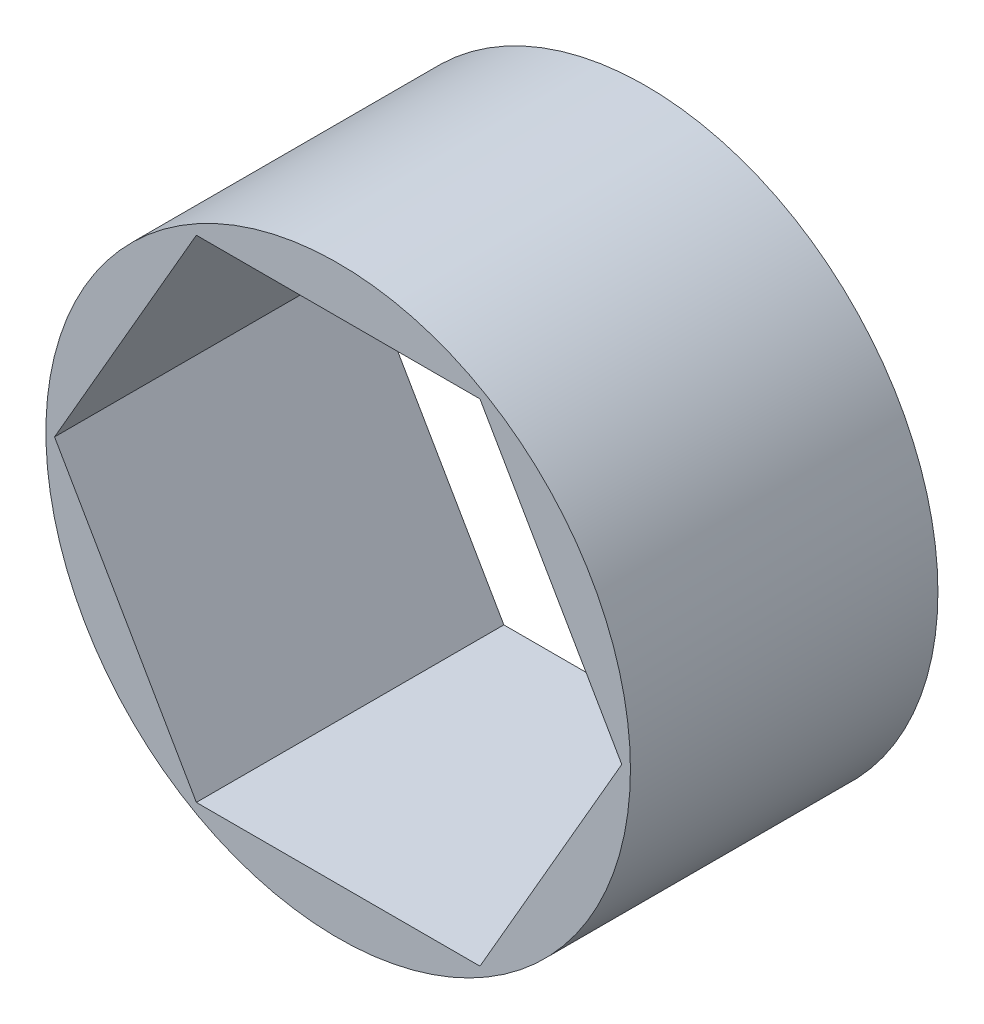
ISO-10303-21;
HEADER;
FILE_DESCRIPTION(('STEP AP214'),'2;1');
FILE_NAME('part.step','',(''),(''),'','','');
FILE_SCHEMA(('AUTOMOTIVE_DESIGN { 1 0 10303 214 1 1 1 1 }'));
ENDSEC;
DATA;
#1=APPLICATION_CONTEXT('core data for automotive mechanical design processes');
#2=APPLICATION_PROTOCOL_DEFINITION('international standard','automotive_design',2000,#1);
#3=PRODUCT_CONTEXT('',#1,'mechanical');
#4=PRODUCT('Part','Part','',(#3));
#5=PRODUCT_RELATED_PRODUCT_CATEGORY('part','',(#4));
#6=PRODUCT_DEFINITION_FORMATION('','',#4);
#7=PRODUCT_DEFINITION_CONTEXT('part definition',#1,'design');
#8=PRODUCT_DEFINITION('design','',#6,#7);
#9=PRODUCT_DEFINITION_SHAPE('','',#8);
#10=(LENGTH_UNIT() NAMED_UNIT(*) SI_UNIT(.MILLI.,.METRE.));
#11=(NAMED_UNIT(*) PLANE_ANGLE_UNIT() SI_UNIT($,.RADIAN.));
#12=(NAMED_UNIT(*) SI_UNIT($,.STERADIAN.) SOLID_ANGLE_UNIT());
#13=UNCERTAINTY_MEASURE_WITH_UNIT(LENGTH_MEASURE(1.E-05),#10,'distance_accuracy_value','');
#14=(GEOMETRIC_REPRESENTATION_CONTEXT(3) GLOBAL_UNCERTAINTY_ASSIGNED_CONTEXT((#13)) GLOBAL_UNIT_ASSIGNED_CONTEXT((#10,
#11,#12)) REPRESENTATION_CONTEXT('',''));
#15=CARTESIAN_POINT('',(0.,0.,0.));
#16=DIRECTION('',(0.,0.,1.));
#17=DIRECTION('',(1.,0.,0.));
#18=AXIS2_PLACEMENT_3D('',#15,#16,#17);
#19=CARTESIAN_POINT('',(0.,0.,7.9502));
#20=DIRECTION('',(0.,0.,-1.));
#21=DIRECTION('',(-1.,0.,0.));
#22=AXIS2_PLACEMENT_3D('',#19,#20,#21);
#23=CYLINDRICAL_SURFACE('',#22,7.5565);
#24=CARTESIAN_POINT('',(0.,0.,7.9502));
#25=DIRECTION('',(0.,0.,1.));
#26=DIRECTION('',(1.,0.,0.));
#27=AXIS2_PLACEMENT_3D('',#24,#25,#26);
#28=CIRCLE('',#27,7.5565);
#29=CARTESIAN_POINT('',(7.5565,0.,7.9502));
#30=VERTEX_POINT('',#29);
#31=EDGE_CURVE('E11',#30,#30,#28,.T.);
#32=ORIENTED_EDGE('',*,*,#31,.F.);
#33=EDGE_LOOP('',(#32));
#34=FACE_BOUND('',#33,.T.);
#35=CARTESIAN_POINT('',(0.,0.,0.));
#36=DIRECTION('',(0.,0.,1.));
#37=DIRECTION('',(1.,0.,0.));
#38=AXIS2_PLACEMENT_3D('',#35,#36,#37);
#39=CIRCLE('',#38,7.5565);
#40=CARTESIAN_POINT('',(7.5565,0.,0.));
#41=VERTEX_POINT('',#40);
#42=EDGE_CURVE('E48',#41,#41,#39,.T.);
#43=ORIENTED_EDGE('',*,*,#42,.T.);
#44=EDGE_LOOP('',(#43));
#45=FACE_BOUND('',#44,.T.);
#46=ADVANCED_FACE('F45',(#34,#45),#23,.T.);
#47=CARTESIAN_POINT('',(0.,0.,7.9502));
#48=DIRECTION('',(0.,0.,1.));
#49=DIRECTION('',(1.,0.,0.));
#50=AXIS2_PLACEMENT_3D('',#47,#48,#49);
#51=PLANE('',#50);
#52=DIRECTION('',(0.5,0.866025403784439,0.));
#53=VECTOR('',#52,1.);
#54=CARTESIAN_POINT('',(3.66617420935413,-6.35,7.9502));
#55=LINE('',#54,#53);
#56=CARTESIAN_POINT('',(3.66617420935413,-6.35,7.9502));
#57=VERTEX_POINT('',#56);
#58=CARTESIAN_POINT('',(7.33234841870825,0.,7.9502));
#59=VERTEX_POINT('',#58);
#60=EDGE_CURVE('E60',#57,#59,#55,.T.);
#61=ORIENTED_EDGE('',*,*,#60,.F.);
#62=DIRECTION('',(1.,0.,0.));
#63=VECTOR('',#62,1.);
#64=CARTESIAN_POINT('',(-3.66617420935412,-6.35,7.9502));
#65=LINE('',#64,#63);
#66=CARTESIAN_POINT('',(-3.66617420935412,-6.35,7.9502));
#67=VERTEX_POINT('',#66);
#68=EDGE_CURVE('E120',#67,#57,#65,.T.);
#69=ORIENTED_EDGE('',*,*,#68,.F.);
#70=DIRECTION('',(0.5,-0.866025403784439,0.));
#71=VECTOR('',#70,1.);
#72=CARTESIAN_POINT('',(-7.33234841870825,0.,7.9502));
#73=LINE('',#72,#71);
#74=CARTESIAN_POINT('',(-7.33234841870825,0.,7.9502));
#75=VERTEX_POINT('',#74);
#76=EDGE_CURVE('E124',#75,#67,#73,.T.);
#77=ORIENTED_EDGE('',*,*,#76,.F.);
#78=DIRECTION('',(-0.5,-0.866025403784439,0.));
#79=VECTOR('',#78,1.);
#80=CARTESIAN_POINT('',(-3.66617420935412,6.35,7.9502));
#81=LINE('',#80,#79);
#82=CARTESIAN_POINT('',(-3.66617420935412,6.35,7.9502));
#83=VERTEX_POINT('',#82);
#84=EDGE_CURVE('E147',#83,#75,#81,.T.);
#85=ORIENTED_EDGE('',*,*,#84,.F.);
#86=DIRECTION('',(-1.,0.,0.));
#87=VECTOR('',#86,1.);
#88=CARTESIAN_POINT('',(3.66617420935412,6.35,7.9502));
#89=LINE('',#88,#87);
#90=CARTESIAN_POINT('',(3.66617420935412,6.35,7.9502));
#91=VERTEX_POINT('',#90);
#92=EDGE_CURVE('E143',#91,#83,#89,.T.);
#93=ORIENTED_EDGE('',*,*,#92,.F.);
#94=DIRECTION('',(-0.5,0.866025403784438,0.));
#95=VECTOR('',#94,1.);
#96=CARTESIAN_POINT('',(7.33234841870825,0.,7.9502));
#97=LINE('',#96,#95);
#98=EDGE_CURVE('E140',#59,#91,#97,.T.);
#99=ORIENTED_EDGE('',*,*,#98,.F.);
#100=EDGE_LOOP('',(#61,#69,#77,#85,#93,#99));
#101=FACE_BOUND('',#100,.T.);
#102=ORIENTED_EDGE('',*,*,#31,.T.);
#103=EDGE_LOOP('',(#102));
#104=FACE_BOUND('',#103,.T.);
#105=ADVANCED_FACE('F171',(#101,#104),#51,.T.);
#106=CARTESIAN_POINT('',(0.,0.,0.));
#107=DIRECTION('',(0.,0.,1.));
#108=DIRECTION('',(1.,0.,0.));
#109=AXIS2_PLACEMENT_3D('',#106,#107,#108);
#110=PLANE('',#109);
#111=DIRECTION('',(1.,0.,0.));
#112=VECTOR('',#111,1.);
#113=CARTESIAN_POINT('',(-3.66617420935412,-6.35,0.));
#114=LINE('',#113,#112);
#115=CARTESIAN_POINT('',(-3.66617420935412,-6.35,0.));
#116=VERTEX_POINT('',#115);
#117=CARTESIAN_POINT('',(3.66617420935413,-6.35,0.));
#118=VERTEX_POINT('',#117);
#119=EDGE_CURVE('E107',#116,#118,#114,.T.);
#120=ORIENTED_EDGE('',*,*,#119,.T.);
#121=DIRECTION('',(0.5,0.866025403784439,0.));
#122=VECTOR('',#121,1.);
#123=CARTESIAN_POINT('',(3.66617420935413,-6.35,0.));
#124=LINE('',#123,#122);
#125=CARTESIAN_POINT('',(7.33234841870825,0.,0.));
#126=VERTEX_POINT('',#125);
#127=EDGE_CURVE('E100',#118,#126,#124,.T.);
#128=ORIENTED_EDGE('',*,*,#127,.T.);
#129=DIRECTION('',(-0.5,0.866025403784438,0.));
#130=VECTOR('',#129,1.);
#131=CARTESIAN_POINT('',(7.33234841870825,0.,0.));
#132=LINE('',#131,#130);
#133=CARTESIAN_POINT('',(3.66617420935412,6.35,0.));
#134=VERTEX_POINT('',#133);
#135=EDGE_CURVE('E110',#126,#134,#132,.T.);
#136=ORIENTED_EDGE('',*,*,#135,.T.);
#137=DIRECTION('',(-1.,0.,0.));
#138=VECTOR('',#137,1.);
#139=CARTESIAN_POINT('',(3.66617420935412,6.35,0.));
#140=LINE('',#139,#138);
#141=CARTESIAN_POINT('',(-3.66617420935412,6.35,0.));
#142=VERTEX_POINT('',#141);
#143=EDGE_CURVE('E68',#134,#142,#140,.T.);
#144=ORIENTED_EDGE('',*,*,#143,.T.);
#145=DIRECTION('',(-0.5,-0.866025403784439,0.));
#146=VECTOR('',#145,1.);
#147=CARTESIAN_POINT('',(-3.66617420935412,6.35,0.));
#148=LINE('',#147,#146);
#149=CARTESIAN_POINT('',(-7.33234841870825,0.,0.));
#150=VERTEX_POINT('',#149);
#151=EDGE_CURVE('E129',#142,#150,#148,.T.);
#152=ORIENTED_EDGE('',*,*,#151,.T.);
#153=DIRECTION('',(0.5,-0.866025403784439,0.));
#154=VECTOR('',#153,1.);
#155=CARTESIAN_POINT('',(-7.33234841870825,0.,0.));
#156=LINE('',#155,#154);
#157=EDGE_CURVE('E133',#150,#116,#156,.T.);
#158=ORIENTED_EDGE('',*,*,#157,.T.);
#159=EDGE_LOOP('',(#120,#128,#136,#144,#152,#158));
#160=FACE_BOUND('',#159,.T.);
#161=ORIENTED_EDGE('',*,*,#42,.F.);
#162=EDGE_LOOP('',(#161));
#163=FACE_BOUND('',#162,.T.);
#164=ADVANCED_FACE('F115',(#160,#163),#110,.F.);
#165=CARTESIAN_POINT('',(3.66617420935413,-6.35,0.));
#166=DIRECTION('',(0.866025403784439,-0.5,0.));
#167=DIRECTION('',(0.5,0.866025403784439,0.));
#168=AXIS2_PLACEMENT_3D('',#165,#166,#167);
#169=PLANE('',#168);
#170=ORIENTED_EDGE('',*,*,#60,.T.);
#171=DIRECTION('',(0.,0.,1.));
#172=VECTOR('',#171,1.);
#173=CARTESIAN_POINT('',(7.33234841870825,0.,0.));
#174=LINE('',#173,#172);
#175=EDGE_CURVE('E96',#126,#59,#174,.T.);
#176=ORIENTED_EDGE('',*,*,#175,.F.);
#177=ORIENTED_EDGE('',*,*,#127,.F.);
#178=DIRECTION('',(0.,0.,1.));
#179=VECTOR('',#178,1.);
#180=CARTESIAN_POINT('',(3.66617420935413,-6.35,0.));
#181=LINE('',#180,#179);
#182=EDGE_CURVE('E154',#118,#57,#181,.T.);
#183=ORIENTED_EDGE('',*,*,#182,.T.);
#184=EDGE_LOOP('',(#170,#176,#177,#183));
#185=FACE_BOUND('',#184,.T.);
#186=ADVANCED_FACE('F98',(#185),#169,.F.);
#187=CARTESIAN_POINT('',(-3.66617420935412,-6.35,0.));
#188=DIRECTION('',(0.,-1.,0.));
#189=DIRECTION('',(1.,0.,0.));
#190=AXIS2_PLACEMENT_3D('',#187,#188,#189);
#191=PLANE('',#190);
#192=ORIENTED_EDGE('',*,*,#68,.T.);
#193=ORIENTED_EDGE('',*,*,#182,.F.);
#194=ORIENTED_EDGE('',*,*,#119,.F.);
#195=DIRECTION('',(0.,0.,1.));
#196=VECTOR('',#195,1.);
#197=CARTESIAN_POINT('',(-3.66617420935412,-6.35,0.));
#198=LINE('',#197,#196);
#199=EDGE_CURVE('E157',#116,#67,#198,.T.);
#200=ORIENTED_EDGE('',*,*,#199,.T.);
#201=EDGE_LOOP('',(#192,#193,#194,#200));
#202=FACE_BOUND('',#201,.T.);
#203=ADVANCED_FACE('F182',(#202),#191,.F.);
#204=CARTESIAN_POINT('',(-7.33234841870825,0.,0.));
#205=DIRECTION('',(-0.866025403784439,-0.5,0.));
#206=DIRECTION('',(0.5,-0.866025403784439,0.));
#207=AXIS2_PLACEMENT_3D('',#204,#205,#206);
#208=PLANE('',#207);
#209=ORIENTED_EDGE('',*,*,#76,.T.);
#210=ORIENTED_EDGE('',*,*,#199,.F.);
#211=ORIENTED_EDGE('',*,*,#157,.F.);
#212=DIRECTION('',(0.,0.,1.));
#213=VECTOR('',#212,1.);
#214=CARTESIAN_POINT('',(-7.33234841870825,0.,0.));
#215=LINE('',#214,#213);
#216=EDGE_CURVE('E160',#150,#75,#215,.T.);
#217=ORIENTED_EDGE('',*,*,#216,.T.);
#218=EDGE_LOOP('',(#209,#210,#211,#217));
#219=FACE_BOUND('',#218,.T.);
#220=ADVANCED_FACE('F180',(#219),#208,.F.);
#221=CARTESIAN_POINT('',(-3.66617420935412,6.35,0.));
#222=DIRECTION('',(-0.866025403784439,0.5,0.));
#223=DIRECTION('',(-0.5,-0.866025403784439,0.));
#224=AXIS2_PLACEMENT_3D('',#221,#222,#223);
#225=PLANE('',#224);
#226=ORIENTED_EDGE('',*,*,#84,.T.);
#227=ORIENTED_EDGE('',*,*,#216,.F.);
#228=ORIENTED_EDGE('',*,*,#151,.F.);
#229=DIRECTION('',(0.,0.,1.));
#230=VECTOR('',#229,1.);
#231=CARTESIAN_POINT('',(-3.66617420935412,6.35,0.));
#232=LINE('',#231,#230);
#233=EDGE_CURVE('E163',#142,#83,#232,.T.);
#234=ORIENTED_EDGE('',*,*,#233,.T.);
#235=EDGE_LOOP('',(#226,#227,#228,#234));
#236=FACE_BOUND('',#235,.T.);
#237=ADVANCED_FACE('F176',(#236),#225,.F.);
#238=CARTESIAN_POINT('',(3.66617420935412,6.35,0.));
#239=DIRECTION('',(0.,1.,0.));
#240=DIRECTION('',(-1.,0.,0.));
#241=AXIS2_PLACEMENT_3D('',#238,#239,#240);
#242=PLANE('',#241);
#243=ORIENTED_EDGE('',*,*,#92,.T.);
#244=ORIENTED_EDGE('',*,*,#233,.F.);
#245=ORIENTED_EDGE('',*,*,#143,.F.);
#246=DIRECTION('',(0.,0.,1.));
#247=VECTOR('',#246,1.);
#248=CARTESIAN_POINT('',(3.66617420935412,6.35,0.));
#249=LINE('',#248,#247);
#250=EDGE_CURVE('E106',#134,#91,#249,.T.);
#251=ORIENTED_EDGE('',*,*,#250,.T.);
#252=EDGE_LOOP('',(#243,#244,#245,#251));
#253=FACE_BOUND('',#252,.T.);
#254=ADVANCED_FACE('F167',(#253),#242,.F.);
#255=CARTESIAN_POINT('',(7.33234841870825,0.,0.));
#256=DIRECTION('',(0.866025403784439,0.5,0.));
#257=DIRECTION('',(-0.5,0.866025403784439,0.));
#258=AXIS2_PLACEMENT_3D('',#255,#256,#257);
#259=PLANE('',#258);
#260=ORIENTED_EDGE('',*,*,#98,.T.);
#261=ORIENTED_EDGE('',*,*,#250,.F.);
#262=ORIENTED_EDGE('',*,*,#135,.F.);
#263=ORIENTED_EDGE('',*,*,#175,.T.);
#264=EDGE_LOOP('',(#260,#261,#262,#263));
#265=FACE_BOUND('',#264,.T.);
#266=ADVANCED_FACE('F111',(#265),#259,.F.);
#267=CLOSED_SHELL('',(#46,#105,#164,#186,#203,#220,#237,#254,#266));
#268=MANIFOLD_SOLID_BREP('B2',#267);
#269=ADVANCED_BREP_SHAPE_REPRESENTATION('',(#18,#268),#14);
#270=SHAPE_DEFINITION_REPRESENTATION(#9,#269);
ENDSEC;
END-ISO-10303-21;
